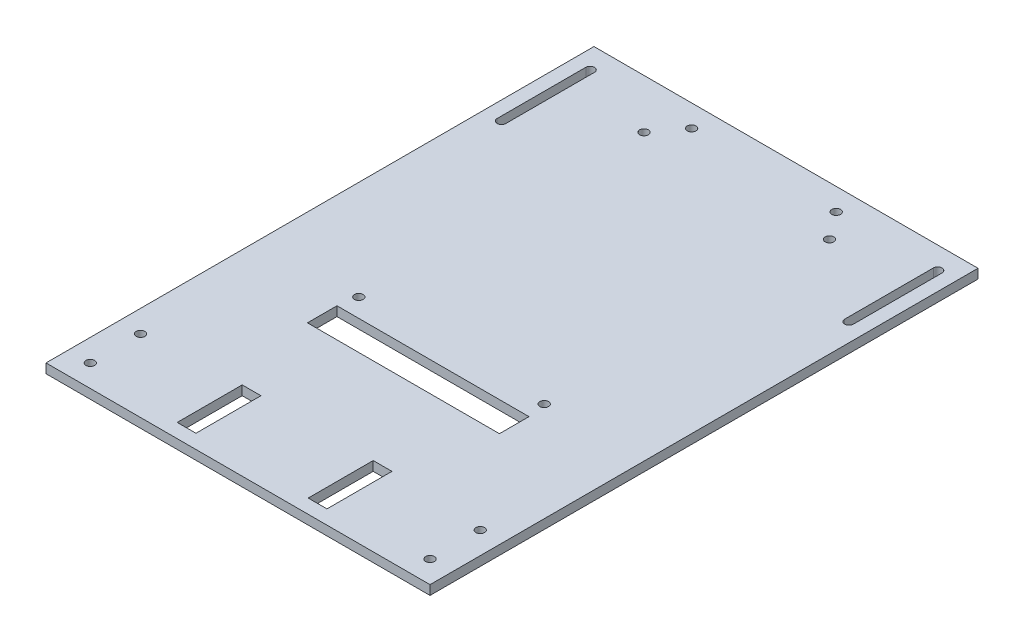
ISO-10303-21;
HEADER;
FILE_DESCRIPTION(('STEP AP214'),'2;1');
FILE_NAME('part.step','',(''),(''),'','','');
FILE_SCHEMA(('AUTOMOTIVE_DESIGN { 1 0 10303 214 1 1 1 1 }'));
ENDSEC;
DATA;
#1=APPLICATION_CONTEXT('core data for automotive mechanical design processes');
#2=APPLICATION_PROTOCOL_DEFINITION('international standard','automotive_design',2000,#1);
#3=PRODUCT_CONTEXT('',#1,'mechanical');
#4=PRODUCT('Part','Part','',(#3));
#5=PRODUCT_RELATED_PRODUCT_CATEGORY('part','',(#4));
#6=PRODUCT_DEFINITION_FORMATION('','',#4);
#7=PRODUCT_DEFINITION_CONTEXT('part definition',#1,'design');
#8=PRODUCT_DEFINITION('design','',#6,#7);
#9=PRODUCT_DEFINITION_SHAPE('','',#8);
#10=(LENGTH_UNIT() NAMED_UNIT(*) SI_UNIT(.MILLI.,.METRE.));
#11=(NAMED_UNIT(*) PLANE_ANGLE_UNIT() SI_UNIT($,.RADIAN.));
#12=(NAMED_UNIT(*) SI_UNIT($,.STERADIAN.) SOLID_ANGLE_UNIT());
#13=UNCERTAINTY_MEASURE_WITH_UNIT(LENGTH_MEASURE(1.E-05),#10,'distance_accuracy_value','');
#14=(GEOMETRIC_REPRESENTATION_CONTEXT(3) GLOBAL_UNCERTAINTY_ASSIGNED_CONTEXT((#13)) GLOBAL_UNIT_ASSIGNED_CONTEXT((#10,
#11,#12)) REPRESENTATION_CONTEXT('',''));
#15=CARTESIAN_POINT('',(0.,0.,0.));
#16=DIRECTION('',(0.,0.,1.));
#17=DIRECTION('',(1.,0.,0.));
#18=AXIS2_PLACEMENT_3D('',#15,#16,#17);
#19=CARTESIAN_POINT('',(0.,3.175,0.));
#20=DIRECTION('',(0.,-1.,0.));
#21=DIRECTION('',(0.,0.,-1.));
#22=AXIS2_PLACEMENT_3D('',#19,#20,#21);
#23=PLANE('',#22);
#24=CARTESIAN_POINT('',(-31.39,3.175,-76.57));
#25=DIRECTION('',(0.,-1.,0.));
#26=DIRECTION('',(0.,0.,-1.));
#27=AXIS2_PLACEMENT_3D('',#24,#25,#26);
#28=CIRCLE('',#27,1.47500000000001);
#29=CARTESIAN_POINT('',(-31.39,3.175,-78.045));
#30=VERTEX_POINT('',#29);
#31=EDGE_CURVE('E265',#30,#30,#28,.T.);
#32=ORIENTED_EDGE('',*,*,#31,.T.);
#33=EDGE_LOOP('',(#32));
#34=FACE_BOUND('',#33,.T.);
#35=CARTESIAN_POINT('',(31.39,3.175,19.98));
#36=DIRECTION('',(0.,-1.,0.));
#37=DIRECTION('',(0.,0.,-1.));
#38=AXIS2_PLACEMENT_3D('',#35,#36,#37);
#39=CIRCLE('',#38,1.475);
#40=CARTESIAN_POINT('',(31.39,3.175,18.505));
#41=VERTEX_POINT('',#40);
#42=EDGE_CURVE('E269',#41,#41,#39,.T.);
#43=ORIENTED_EDGE('',*,*,#42,.T.);
#44=EDGE_LOOP('',(#43));
#45=FACE_BOUND('',#44,.T.);
#46=CARTESIAN_POINT('',(31.39,3.175,-76.57));
#47=DIRECTION('',(0.,-1.,0.));
#48=DIRECTION('',(0.,0.,-1.));
#49=AXIS2_PLACEMENT_3D('',#46,#47,#48);
#50=CIRCLE('',#49,1.47500000000001);
#51=CARTESIAN_POINT('',(31.39,3.175,-78.045));
#52=VERTEX_POINT('',#51);
#53=EDGE_CURVE('E273',#52,#52,#50,.T.);
#54=ORIENTED_EDGE('',*,*,#53,.T.);
#55=EDGE_LOOP('',(#54));
#56=FACE_BOUND('',#55,.T.);
#57=CARTESIAN_POINT('',(-31.39,3.175,19.98));
#58=DIRECTION('',(0.,-1.,0.));
#59=DIRECTION('',(0.,0.,-1.));
#60=AXIS2_PLACEMENT_3D('',#57,#58,#59);
#61=CIRCLE('',#60,1.47500000000001);
#62=CARTESIAN_POINT('',(-31.39,3.175,18.505));
#63=VERTEX_POINT('',#62);
#64=EDGE_CURVE('E277',#63,#63,#61,.T.);
#65=ORIENTED_EDGE('',*,*,#64,.T.);
#66=EDGE_LOOP('',(#65));
#67=FACE_BOUND('',#66,.T.);
#68=DIRECTION('',(0.,0.,-1.));
#69=VECTOR('',#68,1.);
#70=CARTESIAN_POINT('',(65.,3.175,92.25));
#71=LINE('',#70,#69);
#72=CARTESIAN_POINT('',(65.,3.175,92.25));
#73=VERTEX_POINT('',#72);
#74=CARTESIAN_POINT('',(65.,3.175,-93.25));
#75=VERTEX_POINT('',#74);
#76=EDGE_CURVE('E392',#73,#75,#71,.T.);
#77=ORIENTED_EDGE('',*,*,#76,.T.);
#78=DIRECTION('',(1.,0.,0.));
#79=VECTOR('',#78,1.);
#80=CARTESIAN_POINT('',(65.,3.175,-93.25));
#81=LINE('',#80,#79);
#82=CARTESIAN_POINT('',(-65.,3.175,-93.25));
#83=VERTEX_POINT('',#82);
#84=EDGE_CURVE('E580',#83,#75,#81,.T.);
#85=ORIENTED_EDGE('',*,*,#84,.F.);
#86=DIRECTION('',(0.,0.,1.));
#87=VECTOR('',#86,1.);
#88=CARTESIAN_POINT('',(-65.,3.175,92.25));
#89=LINE('',#88,#87);
#90=CARTESIAN_POINT('',(-65.,3.175,92.25));
#91=VERTEX_POINT('',#90);
#92=EDGE_CURVE('E401',#83,#91,#89,.T.);
#93=ORIENTED_EDGE('',*,*,#92,.T.);
#94=DIRECTION('',(1.,0.,0.));
#95=VECTOR('',#94,1.);
#96=CARTESIAN_POINT('',(-65.,3.175,92.25));
#97=LINE('',#96,#95);
#98=EDGE_CURVE('E395',#91,#73,#97,.T.);
#99=ORIENTED_EDGE('',*,*,#98,.T.);
#100=EDGE_LOOP('',(#77,#85,#93,#99));
#101=FACE_BOUND('',#100,.T.);
#102=DIRECTION('',(0.,0.,-1.));
#103=VECTOR('',#102,1.);
#104=CARTESIAN_POINT('',(57.35,3.175,-85.775));
#105=LINE('',#104,#103);
#106=CARTESIAN_POINT('',(57.35,3.175,-55.775));
#107=VERTEX_POINT('',#106);
#108=CARTESIAN_POINT('',(57.35,3.175,-85.775));
#109=VERTEX_POINT('',#108);
#110=EDGE_CURVE('E414',#107,#109,#105,.T.);
#111=ORIENTED_EDGE('',*,*,#110,.T.);
#112=CARTESIAN_POINT('',(58.825,3.175,-85.775));
#113=DIRECTION('',(0.,-1.,0.));
#114=DIRECTION('',(0.,0.,-1.));
#115=AXIS2_PLACEMENT_3D('',#112,#113,#114);
#116=CIRCLE('',#115,1.47499999999999);
#117=CARTESIAN_POINT('',(60.3,3.175,-85.775));
#118=VERTEX_POINT('',#117);
#119=EDGE_CURVE('E428',#109,#118,#116,.T.);
#120=ORIENTED_EDGE('',*,*,#119,.T.);
#121=DIRECTION('',(0.,0.,1.));
#122=VECTOR('',#121,1.);
#123=CARTESIAN_POINT('',(60.3,3.175,-85.775));
#124=LINE('',#123,#122);
#125=CARTESIAN_POINT('',(60.3,3.175,-55.775));
#126=VERTEX_POINT('',#125);
#127=EDGE_CURVE('E454',#118,#126,#124,.T.);
#128=ORIENTED_EDGE('',*,*,#127,.T.);
#129=CARTESIAN_POINT('',(58.825,3.175,-55.775));
#130=DIRECTION('',(0.,-1.,0.));
#131=DIRECTION('',(0.,0.,-1.));
#132=AXIS2_PLACEMENT_3D('',#129,#130,#131);
#133=CIRCLE('',#132,1.47499999999999);
#134=EDGE_CURVE('E450',#126,#107,#133,.T.);
#135=ORIENTED_EDGE('',*,*,#134,.T.);
#136=EDGE_LOOP('',(#111,#120,#128,#135));
#137=FACE_BOUND('',#136,.T.);
#138=CARTESIAN_POINT('',(57.5,3.175,84.75));
#139=DIRECTION('',(0.,-1.,0.));
#140=DIRECTION('',(0.,0.,-1.));
#141=AXIS2_PLACEMENT_3D('',#138,#139,#140);
#142=CIRCLE('',#141,1.475);
#143=CARTESIAN_POINT('',(57.5,3.175,83.275));
#144=VERTEX_POINT('',#143);
#145=EDGE_CURVE('E560',#144,#144,#142,.T.);
#146=ORIENTED_EDGE('',*,*,#145,.T.);
#147=EDGE_LOOP('',(#146));
#148=FACE_BOUND('',#147,.T.);
#149=CARTESIAN_POINT('',(57.5,3.175,67.75));
#150=DIRECTION('',(0.,-1.,0.));
#151=DIRECTION('',(0.,0.,-1.));
#152=AXIS2_PLACEMENT_3D('',#149,#150,#151);
#153=CIRCLE('',#152,1.475);
#154=CARTESIAN_POINT('',(57.5,3.175,66.275));
#155=VERTEX_POINT('',#154);
#156=EDGE_CURVE('E552',#155,#155,#153,.T.);
#157=ORIENTED_EDGE('',*,*,#156,.T.);
#158=EDGE_LOOP('',(#157));
#159=FACE_BOUND('',#158,.T.);
#160=CARTESIAN_POINT('',(-57.5,3.175,84.75));
#161=DIRECTION('',(0.,-1.,0.));
#162=DIRECTION('',(0.,0.,-1.));
#163=AXIS2_PLACEMENT_3D('',#160,#161,#162);
#164=CIRCLE('',#163,1.475);
#165=CARTESIAN_POINT('',(-57.5,3.175,83.275));
#166=VERTEX_POINT('',#165);
#167=EDGE_CURVE('E541',#166,#166,#164,.T.);
#168=ORIENTED_EDGE('',*,*,#167,.T.);
#169=EDGE_LOOP('',(#168));
#170=FACE_BOUND('',#169,.T.);
#171=CARTESIAN_POINT('',(-57.5,3.175,67.75));
#172=DIRECTION('',(0.,-1.,0.));
#173=DIRECTION('',(0.,0.,-1.));
#174=AXIS2_PLACEMENT_3D('',#171,#172,#173);
#175=CIRCLE('',#174,1.475);
#176=CARTESIAN_POINT('',(-57.5,3.175,66.275));
#177=VERTEX_POINT('',#176);
#178=EDGE_CURVE('E483',#177,#177,#175,.T.);
#179=ORIENTED_EDGE('',*,*,#178,.T.);
#180=EDGE_LOOP('',(#179));
#181=FACE_BOUND('',#180,.T.);
#182=DIRECTION('',(0.,0.,-1.));
#183=VECTOR('',#182,1.);
#184=CARTESIAN_POINT('',(-60.3,3.175,-85.775));
#185=LINE('',#184,#183);
#186=CARTESIAN_POINT('',(-60.3,3.175,-55.775));
#187=VERTEX_POINT('',#186);
#188=CARTESIAN_POINT('',(-60.3,3.175,-85.775));
#189=VERTEX_POINT('',#188);
#190=EDGE_CURVE('E474',#187,#189,#185,.T.);
#191=ORIENTED_EDGE('',*,*,#190,.T.);
#192=CARTESIAN_POINT('',(-58.825,3.175,-85.775));
#193=DIRECTION('',(0.,-1.,0.));
#194=DIRECTION('',(0.,0.,-1.));
#195=AXIS2_PLACEMENT_3D('',#192,#193,#194);
#196=CIRCLE('',#195,1.475);
#197=CARTESIAN_POINT('',(-57.35,3.175,-85.775));
#198=VERTEX_POINT('',#197);
#199=EDGE_CURVE('E461',#189,#198,#196,.T.);
#200=ORIENTED_EDGE('',*,*,#199,.T.);
#201=DIRECTION('',(0.,0.,1.));
#202=VECTOR('',#201,1.);
#203=CARTESIAN_POINT('',(-57.35,3.175,-85.775));
#204=LINE('',#203,#202);
#205=CARTESIAN_POINT('',(-57.35,3.175,-55.775));
#206=VERTEX_POINT('',#205);
#207=EDGE_CURVE('E466',#198,#206,#204,.T.);
#208=ORIENTED_EDGE('',*,*,#207,.T.);
#209=CARTESIAN_POINT('',(-58.825,3.175,-55.775));
#210=DIRECTION('',(0.,-1.,0.));
#211=DIRECTION('',(0.,0.,-1.));
#212=AXIS2_PLACEMENT_3D('',#209,#210,#211);
#213=CIRCLE('',#212,1.475);
#214=EDGE_CURVE('E470',#206,#187,#213,.T.);
#215=ORIENTED_EDGE('',*,*,#214,.T.);
#216=EDGE_LOOP('',(#191,#200,#208,#215));
#217=FACE_BOUND('',#216,.T.);
#218=CARTESIAN_POINT('',(24.475,3.175,-85.775));
#219=DIRECTION('',(0.,-1.,0.));
#220=DIRECTION('',(0.,0.,-1.));
#221=AXIS2_PLACEMENT_3D('',#218,#219,#220);
#222=CIRCLE('',#221,1.47500000000001);
#223=CARTESIAN_POINT('',(24.475,3.175,-87.25));
#224=VERTEX_POINT('',#223);
#225=EDGE_CURVE('E571',#224,#224,#222,.T.);
#226=ORIENTED_EDGE('',*,*,#225,.T.);
#227=EDGE_LOOP('',(#226));
#228=FACE_BOUND('',#227,.T.);
#229=CARTESIAN_POINT('',(-24.475,3.175,-85.775));
#230=DIRECTION('',(0.,-1.,0.));
#231=DIRECTION('',(0.,0.,-1.));
#232=AXIS2_PLACEMENT_3D('',#229,#230,#231);
#233=CIRCLE('',#232,1.47500000000001);
#234=CARTESIAN_POINT('',(-24.475,3.175,-87.25));
#235=VERTEX_POINT('',#234);
#236=EDGE_CURVE('E529',#235,#235,#233,.T.);
#237=ORIENTED_EDGE('',*,*,#236,.T.);
#238=EDGE_LOOP('',(#237));
#239=FACE_BOUND('',#238,.T.);
#240=DIRECTION('',(-1.,0.,0.));
#241=VECTOR('',#240,1.);
#242=CARTESIAN_POINT('',(0.,3.175,87.48843537));
#243=LINE('',#242,#241);
#244=CARTESIAN_POINT('',(-19.,3.175,87.48843537));
#245=VERTEX_POINT('',#244);
#246=CARTESIAN_POINT('',(-25.35,3.175,87.48843537));
#247=VERTEX_POINT('',#246);
#248=EDGE_CURVE('E333',#245,#247,#243,.T.);
#249=ORIENTED_EDGE('',*,*,#248,.T.);
#250=DIRECTION('',(0.,0.,-1.));
#251=VECTOR('',#250,1.);
#252=CARTESIAN_POINT('',(-25.35,3.175,0.));
#253=LINE('',#252,#251);
#254=CARTESIAN_POINT('',(-25.35,3.175,65.48843537));
#255=VERTEX_POINT('',#254);
#256=EDGE_CURVE('E346',#247,#255,#253,.T.);
#257=ORIENTED_EDGE('',*,*,#256,.T.);
#258=DIRECTION('',(1.,0.,0.));
#259=VECTOR('',#258,1.);
#260=CARTESIAN_POINT('',(0.,3.175,65.48843537));
#261=LINE('',#260,#259);
#262=CARTESIAN_POINT('',(-19.,3.175,65.48843537));
#263=VERTEX_POINT('',#262);
#264=EDGE_CURVE('E342',#255,#263,#261,.T.);
#265=ORIENTED_EDGE('',*,*,#264,.T.);
#266=DIRECTION('',(0.,0.,1.));
#267=VECTOR('',#266,1.);
#268=CARTESIAN_POINT('',(-19.,3.175,0.));
#269=LINE('',#268,#267);
#270=EDGE_CURVE('E337',#263,#245,#269,.T.);
#271=ORIENTED_EDGE('',*,*,#270,.T.);
#272=EDGE_LOOP('',(#249,#257,#265,#271));
#273=FACE_BOUND('',#272,.T.);
#274=DIRECTION('',(-1.,0.,0.));
#275=VECTOR('',#274,1.);
#276=CARTESIAN_POINT('',(0.,3.175,87.48843537));
#277=LINE('',#276,#275);
#278=CARTESIAN_POINT('',(25.35,3.175,87.48843537));
#279=VERTEX_POINT('',#278);
#280=CARTESIAN_POINT('',(19.,3.175,87.48843537));
#281=VERTEX_POINT('',#280);
#282=EDGE_CURVE('E350',#279,#281,#277,.T.);
#283=ORIENTED_EDGE('',*,*,#282,.T.);
#284=DIRECTION('',(0.,0.,-1.));
#285=VECTOR('',#284,1.);
#286=CARTESIAN_POINT('',(19.,3.175,0.));
#287=LINE('',#286,#285);
#288=CARTESIAN_POINT('',(19.,3.175,65.48843537));
#289=VERTEX_POINT('',#288);
#290=EDGE_CURVE('E362',#281,#289,#287,.T.);
#291=ORIENTED_EDGE('',*,*,#290,.T.);
#292=DIRECTION('',(1.,0.,0.));
#293=VECTOR('',#292,1.);
#294=CARTESIAN_POINT('',(0.,3.175,65.48843537));
#295=LINE('',#294,#293);
#296=CARTESIAN_POINT('',(25.35,3.175,65.48843537));
#297=VERTEX_POINT('',#296);
#298=EDGE_CURVE('E358',#289,#297,#295,.T.);
#299=ORIENTED_EDGE('',*,*,#298,.T.);
#300=DIRECTION('',(0.,0.,1.));
#301=VECTOR('',#300,1.);
#302=CARTESIAN_POINT('',(25.35,3.175,0.));
#303=LINE('',#302,#301);
#304=EDGE_CURVE('E354',#297,#279,#303,.T.);
#305=ORIENTED_EDGE('',*,*,#304,.T.);
#306=EDGE_LOOP('',(#283,#291,#299,#305));
#307=FACE_BOUND('',#306,.T.);
#308=DIRECTION('',(0.,0.,-1.));
#309=VECTOR('',#308,1.);
#310=CARTESIAN_POINT('',(32.5,3.175,0.));
#311=LINE('',#310,#309);
#312=CARTESIAN_POINT('',(32.5,3.175,36.25));
#313=VERTEX_POINT('',#312);
#314=CARTESIAN_POINT('',(32.5,3.175,26.25));
#315=VERTEX_POINT('',#314);
#316=EDGE_CURVE('E306',#313,#315,#311,.T.);
#317=ORIENTED_EDGE('',*,*,#316,.F.);
#318=DIRECTION('',(1.,0.,0.));
#319=VECTOR('',#318,1.);
#320=CARTESIAN_POINT('',(0.,3.175,36.25));
#321=LINE('',#320,#319);
#322=CARTESIAN_POINT('',(-32.5,3.175,36.25));
#323=VERTEX_POINT('',#322);
#324=EDGE_CURVE('E1143',#323,#313,#321,.T.);
#325=ORIENTED_EDGE('',*,*,#324,.F.);
#326=DIRECTION('',(0.,0.,-1.));
#327=VECTOR('',#326,1.);
#328=CARTESIAN_POINT('',(-32.5,3.175,0.));
#329=LINE('',#328,#327);
#330=CARTESIAN_POINT('',(-32.5,3.175,26.25));
#331=VERTEX_POINT('',#330);
#332=EDGE_CURVE('E234',#323,#331,#329,.T.);
#333=ORIENTED_EDGE('',*,*,#332,.T.);
#334=DIRECTION('',(1.,0.,0.));
#335=VECTOR('',#334,1.);
#336=CARTESIAN_POINT('',(0.,3.175,26.25));
#337=LINE('',#336,#335);
#338=EDGE_CURVE('E1141',#331,#315,#337,.T.);
#339=ORIENTED_EDGE('',*,*,#338,.T.);
#340=EDGE_LOOP('',(#317,#325,#333,#339));
#341=FACE_BOUND('',#340,.T.);
#342=ADVANCED_FACE('F66',(#34,#45,#56,#67,#101,#137,#148,#159,#170,#181,#217,#228,#239,#273,
#307,#341),#23,.F.);
#343=CARTESIAN_POINT('',(0.,0.,0.));
#344=DIRECTION('',(0.,-1.,0.));
#345=DIRECTION('',(0.,0.,-1.));
#346=AXIS2_PLACEMENT_3D('',#343,#344,#345);
#347=PLANE('',#346);
#348=CARTESIAN_POINT('',(-31.39,0.,-76.57));
#349=DIRECTION('',(0.,-1.,0.));
#350=DIRECTION('',(0.,0.,-1.));
#351=AXIS2_PLACEMENT_3D('',#348,#349,#350);
#352=CIRCLE('',#351,1.47500000000001);
#353=CARTESIAN_POINT('',(-31.39,0.,-78.045));
#354=VERTEX_POINT('',#353);
#355=EDGE_CURVE('E286',#354,#354,#352,.T.);
#356=ORIENTED_EDGE('',*,*,#355,.F.);
#357=EDGE_LOOP('',(#356));
#358=FACE_BOUND('',#357,.T.);
#359=CARTESIAN_POINT('',(31.39,0.,19.98));
#360=DIRECTION('',(0.,-1.,0.));
#361=DIRECTION('',(0.,0.,-1.));
#362=AXIS2_PLACEMENT_3D('',#359,#360,#361);
#363=CIRCLE('',#362,1.475);
#364=CARTESIAN_POINT('',(31.39,0.,18.505));
#365=VERTEX_POINT('',#364);
#366=EDGE_CURVE('E287',#365,#365,#363,.T.);
#367=ORIENTED_EDGE('',*,*,#366,.F.);
#368=EDGE_LOOP('',(#367));
#369=FACE_BOUND('',#368,.T.);
#370=CARTESIAN_POINT('',(31.39,0.,-76.57));
#371=DIRECTION('',(0.,-1.,0.));
#372=DIRECTION('',(0.,0.,-1.));
#373=AXIS2_PLACEMENT_3D('',#370,#371,#372);
#374=CIRCLE('',#373,1.47500000000001);
#375=CARTESIAN_POINT('',(31.39,0.,-78.045));
#376=VERTEX_POINT('',#375);
#377=EDGE_CURVE('E816',#376,#376,#374,.T.);
#378=ORIENTED_EDGE('',*,*,#377,.F.);
#379=EDGE_LOOP('',(#378));
#380=FACE_BOUND('',#379,.T.);
#381=CARTESIAN_POINT('',(-31.39,0.,19.98));
#382=DIRECTION('',(0.,-1.,0.));
#383=DIRECTION('',(0.,0.,-1.));
#384=AXIS2_PLACEMENT_3D('',#381,#382,#383);
#385=CIRCLE('',#384,1.47500000000001);
#386=CARTESIAN_POINT('',(-31.39,0.,18.505));
#387=VERTEX_POINT('',#386);
#388=EDGE_CURVE('E281',#387,#387,#385,.T.);
#389=ORIENTED_EDGE('',*,*,#388,.F.);
#390=EDGE_LOOP('',(#389));
#391=FACE_BOUND('',#390,.T.);
#392=DIRECTION('',(0.,0.,1.));
#393=VECTOR('',#392,1.);
#394=CARTESIAN_POINT('',(19.,0.,87.48843537));
#395=LINE('',#394,#393);
#396=CARTESIAN_POINT('',(19.,0.,65.48843537));
#397=VERTEX_POINT('',#396);
#398=CARTESIAN_POINT('',(19.,0.,87.48843537));
#399=VERTEX_POINT('',#398);
#400=EDGE_CURVE('E299',#397,#399,#395,.T.);
#401=ORIENTED_EDGE('',*,*,#400,.T.);
#402=DIRECTION('',(1.,0.,0.));
#403=VECTOR('',#402,1.);
#404=CARTESIAN_POINT('',(19.,0.,87.48843537));
#405=LINE('',#404,#403);
#406=CARTESIAN_POINT('',(25.35,0.,87.48843537));
#407=VERTEX_POINT('',#406);
#408=EDGE_CURVE('E304',#399,#407,#405,.T.);
#409=ORIENTED_EDGE('',*,*,#408,.T.);
#410=DIRECTION('',(0.,0.,-1.));
#411=VECTOR('',#410,1.);
#412=CARTESIAN_POINT('',(25.35,0.,87.48843537));
#413=LINE('',#412,#411);
#414=CARTESIAN_POINT('',(25.35,0.,65.48843537));
#415=VERTEX_POINT('',#414);
#416=EDGE_CURVE('E312',#407,#415,#413,.T.);
#417=ORIENTED_EDGE('',*,*,#416,.T.);
#418=DIRECTION('',(-1.,0.,0.));
#419=VECTOR('',#418,1.);
#420=CARTESIAN_POINT('',(19.,0.,65.48843537));
#421=LINE('',#420,#419);
#422=EDGE_CURVE('E317',#415,#397,#421,.T.);
#423=ORIENTED_EDGE('',*,*,#422,.T.);
#424=EDGE_LOOP('',(#401,#409,#417,#423));
#425=FACE_BOUND('',#424,.T.);
#426=DIRECTION('',(0.,0.,1.));
#427=VECTOR('',#426,1.);
#428=CARTESIAN_POINT('',(-25.35,0.,87.48843537));
#429=LINE('',#428,#427);
#430=CARTESIAN_POINT('',(-25.35,0.,65.48843537));
#431=VERTEX_POINT('',#430);
#432=CARTESIAN_POINT('',(-25.35,0.,87.48843537));
#433=VERTEX_POINT('',#432);
#434=EDGE_CURVE('E305',#431,#433,#429,.T.);
#435=ORIENTED_EDGE('',*,*,#434,.T.);
#436=DIRECTION('',(1.,0.,0.));
#437=VECTOR('',#436,1.);
#438=CARTESIAN_POINT('',(-25.35,0.,87.48843537));
#439=LINE('',#438,#437);
#440=CARTESIAN_POINT('',(-19.,0.,87.48843537));
#441=VERTEX_POINT('',#440);
#442=EDGE_CURVE('E330',#433,#441,#439,.T.);
#443=ORIENTED_EDGE('',*,*,#442,.T.);
#444=DIRECTION('',(0.,0.,-1.));
#445=VECTOR('',#444,1.);
#446=CARTESIAN_POINT('',(-19.,0.,87.48843537));
#447=LINE('',#446,#445);
#448=CARTESIAN_POINT('',(-19.,0.,65.48843537));
#449=VERTEX_POINT('',#448);
#450=EDGE_CURVE('E591',#441,#449,#447,.T.);
#451=ORIENTED_EDGE('',*,*,#450,.T.);
#452=DIRECTION('',(-1.,0.,0.));
#453=VECTOR('',#452,1.);
#454=CARTESIAN_POINT('',(-25.35,0.,65.48843537));
#455=LINE('',#454,#453);
#456=EDGE_CURVE('E586',#449,#431,#455,.T.);
#457=ORIENTED_EDGE('',*,*,#456,.T.);
#458=EDGE_LOOP('',(#435,#443,#451,#457));
#459=FACE_BOUND('',#458,.T.);
#460=CARTESIAN_POINT('',(-24.475,0.,-85.775));
#461=DIRECTION('',(0.,-1.,0.));
#462=DIRECTION('',(0.,0.,-1.));
#463=AXIS2_PLACEMENT_3D('',#460,#461,#462);
#464=CIRCLE('',#463,1.47500000000001);
#465=CARTESIAN_POINT('',(-24.475,0.,-87.25));
#466=VERTEX_POINT('',#465);
#467=EDGE_CURVE('E574',#466,#466,#464,.T.);
#468=ORIENTED_EDGE('',*,*,#467,.F.);
#469=EDGE_LOOP('',(#468));
#470=FACE_BOUND('',#469,.T.);
#471=CARTESIAN_POINT('',(24.475,0.,-85.775));
#472=DIRECTION('',(0.,-1.,0.));
#473=DIRECTION('',(0.,0.,-1.));
#474=AXIS2_PLACEMENT_3D('',#471,#472,#473);
#475=CIRCLE('',#474,1.47500000000001);
#476=CARTESIAN_POINT('',(24.475,0.,-87.25));
#477=VERTEX_POINT('',#476);
#478=EDGE_CURVE('E575',#477,#477,#475,.T.);
#479=ORIENTED_EDGE('',*,*,#478,.F.);
#480=EDGE_LOOP('',(#479));
#481=FACE_BOUND('',#480,.T.);
#482=CARTESIAN_POINT('',(-58.825,0.,-85.775));
#483=DIRECTION('',(0.,-1.,0.));
#484=DIRECTION('',(0.,0.,-1.));
#485=AXIS2_PLACEMENT_3D('',#482,#483,#484);
#486=CIRCLE('',#485,1.475);
#487=CARTESIAN_POINT('',(-60.3,0.,-85.775));
#488=VERTEX_POINT('',#487);
#489=CARTESIAN_POINT('',(-57.35,0.,-85.775));
#490=VERTEX_POINT('',#489);
#491=EDGE_CURVE('E479',#488,#490,#486,.T.);
#492=ORIENTED_EDGE('',*,*,#491,.F.);
#493=DIRECTION('',(0.,0.,-1.));
#494=VECTOR('',#493,1.);
#495=CARTESIAN_POINT('',(-60.3,0.,-85.775));
#496=LINE('',#495,#494);
#497=CARTESIAN_POINT('',(-60.3,0.,-55.775));
#498=VERTEX_POINT('',#497);
#499=EDGE_CURVE('E465',#498,#488,#496,.T.);
#500=ORIENTED_EDGE('',*,*,#499,.F.);
#501=CARTESIAN_POINT('',(-58.825,0.,-55.775));
#502=DIRECTION('',(0.,-1.,0.));
#503=DIRECTION('',(0.,0.,-1.));
#504=AXIS2_PLACEMENT_3D('',#501,#502,#503);
#505=CIRCLE('',#504,1.475);
#506=CARTESIAN_POINT('',(-57.35,0.,-55.775));
#507=VERTEX_POINT('',#506);
#508=EDGE_CURVE('E499',#507,#498,#505,.T.);
#509=ORIENTED_EDGE('',*,*,#508,.F.);
#510=DIRECTION('',(0.,0.,1.));
#511=VECTOR('',#510,1.);
#512=CARTESIAN_POINT('',(-57.35,0.,-85.775));
#513=LINE('',#512,#511);
#514=EDGE_CURVE('E484',#490,#507,#513,.T.);
#515=ORIENTED_EDGE('',*,*,#514,.F.);
#516=EDGE_LOOP('',(#492,#500,#509,#515));
#517=FACE_BOUND('',#516,.T.);
#518=CARTESIAN_POINT('',(-57.5,0.,67.75));
#519=DIRECTION('',(0.,-1.,0.));
#520=DIRECTION('',(0.,0.,-1.));
#521=AXIS2_PLACEMENT_3D('',#518,#519,#520);
#522=CIRCLE('',#521,1.475);
#523=CARTESIAN_POINT('',(-57.5,0.,66.275));
#524=VERTEX_POINT('',#523);
#525=EDGE_CURVE('E536',#524,#524,#522,.T.);
#526=ORIENTED_EDGE('',*,*,#525,.F.);
#527=EDGE_LOOP('',(#526));
#528=FACE_BOUND('',#527,.T.);
#529=CARTESIAN_POINT('',(-57.5,0.,84.75));
#530=DIRECTION('',(0.,-1.,0.));
#531=DIRECTION('',(0.,0.,-1.));
#532=AXIS2_PLACEMENT_3D('',#529,#530,#531);
#533=CIRCLE('',#532,1.475);
#534=CARTESIAN_POINT('',(-57.5,0.,83.275));
#535=VERTEX_POINT('',#534);
#536=EDGE_CURVE('E547',#535,#535,#533,.T.);
#537=ORIENTED_EDGE('',*,*,#536,.F.);
#538=EDGE_LOOP('',(#537));
#539=FACE_BOUND('',#538,.T.);
#540=CARTESIAN_POINT('',(57.5,0.,67.75));
#541=DIRECTION('',(0.,-1.,0.));
#542=DIRECTION('',(0.,0.,-1.));
#543=AXIS2_PLACEMENT_3D('',#540,#541,#542);
#544=CIRCLE('',#543,1.475);
#545=CARTESIAN_POINT('',(57.5,0.,66.275));
#546=VERTEX_POINT('',#545);
#547=EDGE_CURVE('E555',#546,#546,#544,.T.);
#548=ORIENTED_EDGE('',*,*,#547,.F.);
#549=EDGE_LOOP('',(#548));
#550=FACE_BOUND('',#549,.T.);
#551=CARTESIAN_POINT('',(57.5,0.,84.75));
#552=DIRECTION('',(0.,-1.,0.));
#553=DIRECTION('',(0.,0.,-1.));
#554=AXIS2_PLACEMENT_3D('',#551,#552,#553);
#555=CIRCLE('',#554,1.475);
#556=CARTESIAN_POINT('',(57.5,0.,83.275));
#557=VERTEX_POINT('',#556);
#558=EDGE_CURVE('E446',#557,#557,#555,.T.);
#559=ORIENTED_EDGE('',*,*,#558,.F.);
#560=EDGE_LOOP('',(#559));
#561=FACE_BOUND('',#560,.T.);
#562=CARTESIAN_POINT('',(58.825,0.,-85.775));
#563=DIRECTION('',(0.,-1.,0.));
#564=DIRECTION('',(0.,0.,-1.));
#565=AXIS2_PLACEMENT_3D('',#562,#563,#564);
#566=CIRCLE('',#565,1.47499999999999);
#567=CARTESIAN_POINT('',(57.35,0.,-85.775));
#568=VERTEX_POINT('',#567);
#569=CARTESIAN_POINT('',(60.3,0.,-85.775));
#570=VERTEX_POINT('',#569);
#571=EDGE_CURVE('E442',#568,#570,#566,.T.);
#572=ORIENTED_EDGE('',*,*,#571,.F.);
#573=DIRECTION('',(0.,0.,-1.));
#574=VECTOR('',#573,1.);
#575=CARTESIAN_POINT('',(57.35,0.,-85.775));
#576=LINE('',#575,#574);
#577=CARTESIAN_POINT('',(57.35,0.,-55.775));
#578=VERTEX_POINT('',#577);
#579=EDGE_CURVE('E423',#578,#568,#576,.T.);
#580=ORIENTED_EDGE('',*,*,#579,.F.);
#581=CARTESIAN_POINT('',(58.825,0.,-55.775));
#582=DIRECTION('',(0.,-1.,0.));
#583=DIRECTION('',(0.,0.,-1.));
#584=AXIS2_PLACEMENT_3D('',#581,#582,#583);
#585=CIRCLE('',#584,1.47499999999999);
#586=CARTESIAN_POINT('',(60.3,0.,-55.775));
#587=VERTEX_POINT('',#586);
#588=EDGE_CURVE('E429',#587,#578,#585,.T.);
#589=ORIENTED_EDGE('',*,*,#588,.F.);
#590=DIRECTION('',(0.,0.,1.));
#591=VECTOR('',#590,1.);
#592=CARTESIAN_POINT('',(60.3,0.,-85.775));
#593=LINE('',#592,#591);
#594=EDGE_CURVE('E438',#570,#587,#593,.T.);
#595=ORIENTED_EDGE('',*,*,#594,.F.);
#596=EDGE_LOOP('',(#572,#580,#589,#595));
#597=FACE_BOUND('',#596,.T.);
#598=DIRECTION('',(0.,0.,-1.));
#599=VECTOR('',#598,1.);
#600=CARTESIAN_POINT('',(65.,0.,92.25));
#601=LINE('',#600,#599);
#602=CARTESIAN_POINT('',(65.,0.,92.25));
#603=VERTEX_POINT('',#602);
#604=CARTESIAN_POINT('',(65.,0.,-93.25));
#605=VERTEX_POINT('',#604);
#606=EDGE_CURVE('E387',#603,#605,#601,.T.);
#607=ORIENTED_EDGE('',*,*,#606,.F.);
#608=DIRECTION('',(1.,0.,0.));
#609=VECTOR('',#608,1.);
#610=CARTESIAN_POINT('',(-65.,0.,92.25));
#611=LINE('',#610,#609);
#612=CARTESIAN_POINT('',(-65.,0.,92.25));
#613=VERTEX_POINT('',#612);
#614=EDGE_CURVE('E386',#613,#603,#611,.T.);
#615=ORIENTED_EDGE('',*,*,#614,.F.);
#616=DIRECTION('',(0.,0.,1.));
#617=VECTOR('',#616,1.);
#618=CARTESIAN_POINT('',(-65.,0.,92.25));
#619=LINE('',#618,#617);
#620=CARTESIAN_POINT('',(-65.,0.,-93.25));
#621=VERTEX_POINT('',#620);
#622=EDGE_CURVE('E382',#621,#613,#619,.T.);
#623=ORIENTED_EDGE('',*,*,#622,.F.);
#624=DIRECTION('',(-1.,0.,0.));
#625=VECTOR('',#624,1.);
#626=CARTESIAN_POINT('',(65.,0.,-93.25));
#627=LINE('',#626,#625);
#628=EDGE_CURVE('E370',#605,#621,#627,.T.);
#629=ORIENTED_EDGE('',*,*,#628,.F.);
#630=EDGE_LOOP('',(#607,#615,#623,#629));
#631=FACE_BOUND('',#630,.T.);
#632=DIRECTION('',(1.,0.,0.));
#633=VECTOR('',#632,1.);
#634=CARTESIAN_POINT('',(0.,0.,36.25));
#635=LINE('',#634,#633);
#636=CARTESIAN_POINT('',(-32.5,0.,36.25));
#637=VERTEX_POINT('',#636);
#638=CARTESIAN_POINT('',(32.5,0.,36.25));
#639=VERTEX_POINT('',#638);
#640=EDGE_CURVE('E241',#637,#639,#635,.T.);
#641=ORIENTED_EDGE('',*,*,#640,.T.);
#642=DIRECTION('',(0.,0.,-1.));
#643=VECTOR('',#642,1.);
#644=CARTESIAN_POINT('',(32.5,0.,0.));
#645=LINE('',#644,#643);
#646=CARTESIAN_POINT('',(32.5,0.,26.25));
#647=VERTEX_POINT('',#646);
#648=EDGE_CURVE('E90',#639,#647,#645,.T.);
#649=ORIENTED_EDGE('',*,*,#648,.T.);
#650=DIRECTION('',(1.,0.,0.));
#651=VECTOR('',#650,1.);
#652=CARTESIAN_POINT('',(0.,0.,26.25));
#653=LINE('',#652,#651);
#654=CARTESIAN_POINT('',(-32.5,0.,26.25));
#655=VERTEX_POINT('',#654);
#656=EDGE_CURVE('E248',#655,#647,#653,.T.);
#657=ORIENTED_EDGE('',*,*,#656,.F.);
#658=DIRECTION('',(0.,0.,-1.));
#659=VECTOR('',#658,1.);
#660=CARTESIAN_POINT('',(-32.5,0.,0.));
#661=LINE('',#660,#659);
#662=EDGE_CURVE('E231',#637,#655,#661,.T.);
#663=ORIENTED_EDGE('',*,*,#662,.F.);
#664=EDGE_LOOP('',(#641,#649,#657,#663));
#665=FACE_BOUND('',#664,.T.);
#666=ADVANCED_FACE('F246',(#358,#369,#380,#391,#425,#459,#470,#481,#517,#528,#539,#550,#561,
#597,#631,#665),#347,.T.);
#667=CARTESIAN_POINT('',(65.,3.175,92.25));
#668=DIRECTION('',(-1.,0.,0.));
#669=DIRECTION('',(0.,0.,1.));
#670=AXIS2_PLACEMENT_3D('',#667,#668,#669);
#671=PLANE('',#670);
#672=ORIENTED_EDGE('',*,*,#606,.T.);
#673=DIRECTION('',(0.,-1.,0.));
#674=VECTOR('',#673,1.);
#675=CARTESIAN_POINT('',(65.,0.,-93.25));
#676=LINE('',#675,#674);
#677=EDGE_CURVE('E366',#75,#605,#676,.T.);
#678=ORIENTED_EDGE('',*,*,#677,.F.);
#679=ORIENTED_EDGE('',*,*,#76,.F.);
#680=DIRECTION('',(0.,-1.,0.));
#681=VECTOR('',#680,1.);
#682=CARTESIAN_POINT('',(65.,3.175,92.25));
#683=LINE('',#682,#681);
#684=EDGE_CURVE('E75',#73,#603,#683,.T.);
#685=ORIENTED_EDGE('',*,*,#684,.T.);
#686=EDGE_LOOP('',(#672,#678,#679,#685));
#687=FACE_BOUND('',#686,.T.);
#688=ADVANCED_FACE('F68',(#687),#671,.F.);
#689=CARTESIAN_POINT('',(-65.,3.175,92.25));
#690=DIRECTION('',(1.,0.,0.));
#691=DIRECTION('',(0.,0.,-1.));
#692=AXIS2_PLACEMENT_3D('',#689,#690,#691);
#693=PLANE('',#692);
#694=ORIENTED_EDGE('',*,*,#622,.T.);
#695=DIRECTION('',(0.,-1.,0.));
#696=VECTOR('',#695,1.);
#697=CARTESIAN_POINT('',(-65.,3.175,92.25));
#698=LINE('',#697,#696);
#699=EDGE_CURVE('E13',#91,#613,#698,.T.);
#700=ORIENTED_EDGE('',*,*,#699,.F.);
#701=ORIENTED_EDGE('',*,*,#92,.F.);
#702=DIRECTION('',(0.,1.,0.));
#703=VECTOR('',#702,1.);
#704=CARTESIAN_POINT('',(-65.,0.,-93.25));
#705=LINE('',#704,#703);
#706=EDGE_CURVE('E375',#621,#83,#705,.T.);
#707=ORIENTED_EDGE('',*,*,#706,.F.);
#708=EDGE_LOOP('',(#694,#700,#701,#707));
#709=FACE_BOUND('',#708,.T.);
#710=ADVANCED_FACE('F674',(#709),#693,.F.);
#711=CARTESIAN_POINT('',(-65.,3.175,92.25));
#712=DIRECTION('',(0.,0.,-1.));
#713=DIRECTION('',(-1.,0.,0.));
#714=AXIS2_PLACEMENT_3D('',#711,#712,#713);
#715=PLANE('',#714);
#716=ORIENTED_EDGE('',*,*,#614,.T.);
#717=ORIENTED_EDGE('',*,*,#684,.F.);
#718=ORIENTED_EDGE('',*,*,#98,.F.);
#719=ORIENTED_EDGE('',*,*,#699,.T.);
#720=EDGE_LOOP('',(#716,#717,#718,#719));
#721=FACE_BOUND('',#720,.T.);
#722=ADVANCED_FACE('F672',(#721),#715,.F.);
#723=CARTESIAN_POINT('',(58.825,3.175,-85.775));
#724=DIRECTION('',(0.,-1.,0.));
#725=DIRECTION('',(0.,0.,-1.));
#726=AXIS2_PLACEMENT_3D('',#723,#724,#725);
#727=CYLINDRICAL_SURFACE('',#726,1.47499999999999);
#728=ORIENTED_EDGE('',*,*,#571,.T.);
#729=DIRECTION('',(0.,-1.,0.));
#730=VECTOR('',#729,1.);
#731=CARTESIAN_POINT('',(60.3,3.175,-85.775));
#732=LINE('',#731,#730);
#733=EDGE_CURVE('E409',#118,#570,#732,.T.);
#734=ORIENTED_EDGE('',*,*,#733,.F.);
#735=ORIENTED_EDGE('',*,*,#119,.F.);
#736=DIRECTION('',(0.,-1.,0.));
#737=VECTOR('',#736,1.);
#738=CARTESIAN_POINT('',(57.35,3.175,-85.775));
#739=LINE('',#738,#737);
#740=EDGE_CURVE('E420',#109,#568,#739,.T.);
#741=ORIENTED_EDGE('',*,*,#740,.T.);
#742=EDGE_LOOP('',(#728,#734,#735,#741));
#743=FACE_BOUND('',#742,.T.);
#744=ADVANCED_FACE('F669',(#743),#727,.F.);
#745=CARTESIAN_POINT('',(57.35,3.175,-85.775));
#746=DIRECTION('',(-1.,0.,0.));
#747=DIRECTION('',(0.,0.,1.));
#748=AXIS2_PLACEMENT_3D('',#745,#746,#747);
#749=PLANE('',#748);
#750=ORIENTED_EDGE('',*,*,#579,.T.);
#751=ORIENTED_EDGE('',*,*,#740,.F.);
#752=ORIENTED_EDGE('',*,*,#110,.F.);
#753=DIRECTION('',(0.,-1.,0.));
#754=VECTOR('',#753,1.);
#755=CARTESIAN_POINT('',(57.35,3.175,-55.775));
#756=LINE('',#755,#754);
#757=EDGE_CURVE('E417',#107,#578,#756,.T.);
#758=ORIENTED_EDGE('',*,*,#757,.T.);
#759=EDGE_LOOP('',(#750,#751,#752,#758));
#760=FACE_BOUND('',#759,.T.);
#761=ADVANCED_FACE('F724',(#760),#749,.F.);
#762=CARTESIAN_POINT('',(58.825,3.175,-55.775));
#763=DIRECTION('',(0.,-1.,0.));
#764=DIRECTION('',(0.,0.,-1.));
#765=AXIS2_PLACEMENT_3D('',#762,#763,#764);
#766=CYLINDRICAL_SURFACE('',#765,1.47499999999999);
#767=ORIENTED_EDGE('',*,*,#588,.T.);
#768=ORIENTED_EDGE('',*,*,#757,.F.);
#769=ORIENTED_EDGE('',*,*,#134,.F.);
#770=DIRECTION('',(0.,-1.,0.));
#771=VECTOR('',#770,1.);
#772=CARTESIAN_POINT('',(60.3,3.175,-55.775));
#773=LINE('',#772,#771);
#774=EDGE_CURVE('E413',#126,#587,#773,.T.);
#775=ORIENTED_EDGE('',*,*,#774,.T.);
#776=EDGE_LOOP('',(#767,#768,#769,#775));
#777=FACE_BOUND('',#776,.T.);
#778=ADVANCED_FACE('F726',(#777),#766,.F.);
#779=CARTESIAN_POINT('',(60.3,3.175,-85.775));
#780=DIRECTION('',(1.,0.,0.));
#781=DIRECTION('',(0.,0.,-1.));
#782=AXIS2_PLACEMENT_3D('',#779,#780,#781);
#783=PLANE('',#782);
#784=ORIENTED_EDGE('',*,*,#594,.T.);
#785=ORIENTED_EDGE('',*,*,#774,.F.);
#786=ORIENTED_EDGE('',*,*,#127,.F.);
#787=ORIENTED_EDGE('',*,*,#733,.T.);
#788=EDGE_LOOP('',(#784,#785,#786,#787));
#789=FACE_BOUND('',#788,.T.);
#790=ADVANCED_FACE('F718',(#789),#783,.F.);
#791=CARTESIAN_POINT('',(57.5,3.175,84.75));
#792=DIRECTION('',(0.,-1.,0.));
#793=DIRECTION('',(0.,0.,-1.));
#794=AXIS2_PLACEMENT_3D('',#791,#792,#793);
#795=CYLINDRICAL_SURFACE('',#794,1.475);
#796=ORIENTED_EDGE('',*,*,#145,.F.);
#797=EDGE_LOOP('',(#796));
#798=FACE_BOUND('',#797,.T.);
#799=ORIENTED_EDGE('',*,*,#558,.T.);
#800=EDGE_LOOP('',(#799));
#801=FACE_BOUND('',#800,.T.);
#802=ADVANCED_FACE('F733',(#798,#801),#795,.F.);
#803=CARTESIAN_POINT('',(57.5,3.175,67.75));
#804=DIRECTION('',(0.,-1.,0.));
#805=DIRECTION('',(0.,0.,-1.));
#806=AXIS2_PLACEMENT_3D('',#803,#804,#805);
#807=CYLINDRICAL_SURFACE('',#806,1.475);
#808=ORIENTED_EDGE('',*,*,#156,.F.);
#809=EDGE_LOOP('',(#808));
#810=FACE_BOUND('',#809,.T.);
#811=ORIENTED_EDGE('',*,*,#547,.T.);
#812=EDGE_LOOP('',(#811));
#813=FACE_BOUND('',#812,.T.);
#814=ADVANCED_FACE('F701',(#810,#813),#807,.F.);
#815=CARTESIAN_POINT('',(-57.5,3.175,84.75));
#816=DIRECTION('',(0.,-1.,0.));
#817=DIRECTION('',(0.,0.,-1.));
#818=AXIS2_PLACEMENT_3D('',#815,#816,#817);
#819=CYLINDRICAL_SURFACE('',#818,1.475);
#820=ORIENTED_EDGE('',*,*,#167,.F.);
#821=EDGE_LOOP('',(#820));
#822=FACE_BOUND('',#821,.T.);
#823=ORIENTED_EDGE('',*,*,#536,.T.);
#824=EDGE_LOOP('',(#823));
#825=FACE_BOUND('',#824,.T.);
#826=ADVANCED_FACE('F697',(#822,#825),#819,.F.);
#827=CARTESIAN_POINT('',(-57.5,3.175,67.75));
#828=DIRECTION('',(0.,-1.,0.));
#829=DIRECTION('',(0.,0.,-1.));
#830=AXIS2_PLACEMENT_3D('',#827,#828,#829);
#831=CYLINDRICAL_SURFACE('',#830,1.475);
#832=ORIENTED_EDGE('',*,*,#178,.F.);
#833=EDGE_LOOP('',(#832));
#834=FACE_BOUND('',#833,.T.);
#835=ORIENTED_EDGE('',*,*,#525,.T.);
#836=EDGE_LOOP('',(#835));
#837=FACE_BOUND('',#836,.T.);
#838=ADVANCED_FACE('F700',(#834,#837),#831,.F.);
#839=CARTESIAN_POINT('',(-58.825,3.175,-85.775));
#840=DIRECTION('',(0.,-1.,0.));
#841=DIRECTION('',(0.,0.,-1.));
#842=AXIS2_PLACEMENT_3D('',#839,#840,#841);
#843=CYLINDRICAL_SURFACE('',#842,1.475);
#844=ORIENTED_EDGE('',*,*,#491,.T.);
#845=DIRECTION('',(0.,-1.,0.));
#846=VECTOR('',#845,1.);
#847=CARTESIAN_POINT('',(-57.35,3.175,-85.775));
#848=LINE('',#847,#846);
#849=EDGE_CURVE('E478',#198,#490,#848,.T.);
#850=ORIENTED_EDGE('',*,*,#849,.F.);
#851=ORIENTED_EDGE('',*,*,#199,.F.);
#852=DIRECTION('',(0.,-1.,0.));
#853=VECTOR('',#852,1.);
#854=CARTESIAN_POINT('',(-60.3,3.175,-85.775));
#855=LINE('',#854,#853);
#856=EDGE_CURVE('E500',#189,#488,#855,.T.);
#857=ORIENTED_EDGE('',*,*,#856,.T.);
#858=EDGE_LOOP('',(#844,#850,#851,#857));
#859=FACE_BOUND('',#858,.T.);
#860=ADVANCED_FACE('F739',(#859),#843,.F.);
#861=CARTESIAN_POINT('',(-60.3,3.175,-85.775));
#862=DIRECTION('',(-1.,0.,0.));
#863=DIRECTION('',(0.,0.,1.));
#864=AXIS2_PLACEMENT_3D('',#861,#862,#863);
#865=PLANE('',#864);
#866=ORIENTED_EDGE('',*,*,#499,.T.);
#867=ORIENTED_EDGE('',*,*,#856,.F.);
#868=ORIENTED_EDGE('',*,*,#190,.F.);
#869=DIRECTION('',(0.,-1.,0.));
#870=VECTOR('',#869,1.);
#871=CARTESIAN_POINT('',(-60.3,3.175,-55.775));
#872=LINE('',#871,#870);
#873=EDGE_CURVE('E524',#187,#498,#872,.T.);
#874=ORIENTED_EDGE('',*,*,#873,.T.);
#875=EDGE_LOOP('',(#866,#867,#868,#874));
#876=FACE_BOUND('',#875,.T.);
#877=ADVANCED_FACE('F521',(#876),#865,.F.);
#878=CARTESIAN_POINT('',(-58.825,3.175,-55.775));
#879=DIRECTION('',(0.,-1.,0.));
#880=DIRECTION('',(0.,0.,-1.));
#881=AXIS2_PLACEMENT_3D('',#878,#879,#880);
#882=CYLINDRICAL_SURFACE('',#881,1.475);
#883=ORIENTED_EDGE('',*,*,#508,.T.);
#884=ORIENTED_EDGE('',*,*,#873,.F.);
#885=ORIENTED_EDGE('',*,*,#214,.F.);
#886=DIRECTION('',(0.,-1.,0.));
#887=VECTOR('',#886,1.);
#888=CARTESIAN_POINT('',(-57.35,3.175,-55.775));
#889=LINE('',#888,#887);
#890=EDGE_CURVE('E516',#206,#507,#889,.T.);
#891=ORIENTED_EDGE('',*,*,#890,.T.);
#892=EDGE_LOOP('',(#883,#884,#885,#891));
#893=FACE_BOUND('',#892,.T.);
#894=ADVANCED_FACE('F738',(#893),#882,.F.);
#895=CARTESIAN_POINT('',(-57.35,3.175,-85.775));
#896=DIRECTION('',(1.,0.,0.));
#897=DIRECTION('',(0.,0.,-1.));
#898=AXIS2_PLACEMENT_3D('',#895,#896,#897);
#899=PLANE('',#898);
#900=ORIENTED_EDGE('',*,*,#514,.T.);
#901=ORIENTED_EDGE('',*,*,#890,.F.);
#902=ORIENTED_EDGE('',*,*,#207,.F.);
#903=ORIENTED_EDGE('',*,*,#849,.T.);
#904=EDGE_LOOP('',(#900,#901,#902,#903));
#905=FACE_BOUND('',#904,.T.);
#906=ADVANCED_FACE('F514',(#905),#899,.F.);
#907=CARTESIAN_POINT('',(24.475,10.,-85.775));
#908=DIRECTION('',(0.,-1.,0.));
#909=DIRECTION('',(0.,0.,-1.));
#910=AXIS2_PLACEMENT_3D('',#907,#908,#909);
#911=CYLINDRICAL_SURFACE('',#910,1.47500000000001);
#912=ORIENTED_EDGE('',*,*,#478,.T.);
#913=EDGE_LOOP('',(#912));
#914=FACE_BOUND('',#913,.T.);
#915=ORIENTED_EDGE('',*,*,#225,.F.);
#916=EDGE_LOOP('',(#915));
#917=FACE_BOUND('',#916,.T.);
#918=ADVANCED_FACE('F744',(#914,#917),#911,.F.);
#919=CARTESIAN_POINT('',(-24.475,10.,-85.775));
#920=DIRECTION('',(0.,-1.,0.));
#921=DIRECTION('',(0.,0.,-1.));
#922=AXIS2_PLACEMENT_3D('',#919,#920,#921);
#923=CYLINDRICAL_SURFACE('',#922,1.47500000000001);
#924=ORIENTED_EDGE('',*,*,#467,.T.);
#925=EDGE_LOOP('',(#924));
#926=FACE_BOUND('',#925,.T.);
#927=ORIENTED_EDGE('',*,*,#236,.F.);
#928=EDGE_LOOP('',(#927));
#929=FACE_BOUND('',#928,.T.);
#930=ADVANCED_FACE('F759',(#926,#929),#923,.F.);
#931=CARTESIAN_POINT('',(0.,0.,-93.25));
#932=DIRECTION('',(0.,0.,1.));
#933=DIRECTION('',(1.,0.,0.));
#934=AXIS2_PLACEMENT_3D('',#931,#932,#933);
#935=PLANE('',#934);
#936=ORIENTED_EDGE('',*,*,#677,.T.);
#937=ORIENTED_EDGE('',*,*,#628,.T.);
#938=ORIENTED_EDGE('',*,*,#706,.T.);
#939=ORIENTED_EDGE('',*,*,#84,.T.);
#940=EDGE_LOOP('',(#936,#937,#938,#939));
#941=FACE_BOUND('',#940,.T.);
#942=ADVANCED_FACE('F763',(#941),#935,.F.);
#943=CARTESIAN_POINT('',(-25.35,0.,87.48843537));
#944=DIRECTION('',(-1.,0.,0.));
#945=DIRECTION('',(0.,0.,1.));
#946=AXIS2_PLACEMENT_3D('',#943,#944,#945);
#947=PLANE('',#946);
#948=DIRECTION('',(0.,1.,0.));
#949=VECTOR('',#948,1.);
#950=CARTESIAN_POINT('',(-25.35,0.,87.48843537));
#951=LINE('',#950,#949);
#952=EDGE_CURVE('E592',#433,#247,#951,.T.);
#953=ORIENTED_EDGE('',*,*,#952,.F.);
#954=ORIENTED_EDGE('',*,*,#434,.F.);
#955=DIRECTION('',(0.,1.,0.));
#956=VECTOR('',#955,1.);
#957=CARTESIAN_POINT('',(-25.35,0.,65.48843537));
#958=LINE('',#957,#956);
#959=EDGE_CURVE('E593',#431,#255,#958,.T.);
#960=ORIENTED_EDGE('',*,*,#959,.T.);
#961=ORIENTED_EDGE('',*,*,#256,.F.);
#962=EDGE_LOOP('',(#953,#954,#960,#961));
#963=FACE_BOUND('',#962,.T.);
#964=ADVANCED_FACE('F767',(#963),#947,.F.);
#965=CARTESIAN_POINT('',(-25.35,0.,65.48843537));
#966=DIRECTION('',(0.,0.,-1.));
#967=DIRECTION('',(-1.,0.,0.));
#968=AXIS2_PLACEMENT_3D('',#965,#966,#967);
#969=PLANE('',#968);
#970=ORIENTED_EDGE('',*,*,#959,.F.);
#971=ORIENTED_EDGE('',*,*,#456,.F.);
#972=DIRECTION('',(0.,1.,0.));
#973=VECTOR('',#972,1.);
#974=CARTESIAN_POINT('',(-19.,0.,65.48843537));
#975=LINE('',#974,#973);
#976=EDGE_CURVE('E612',#449,#263,#975,.T.);
#977=ORIENTED_EDGE('',*,*,#976,.T.);
#978=ORIENTED_EDGE('',*,*,#264,.F.);
#979=EDGE_LOOP('',(#970,#971,#977,#978));
#980=FACE_BOUND('',#979,.T.);
#981=ADVANCED_FACE('F769',(#980),#969,.F.);
#982=CARTESIAN_POINT('',(-19.,0.,87.48843537));
#983=DIRECTION('',(1.,0.,0.));
#984=DIRECTION('',(0.,0.,-1.));
#985=AXIS2_PLACEMENT_3D('',#982,#983,#984);
#986=PLANE('',#985);
#987=ORIENTED_EDGE('',*,*,#976,.F.);
#988=ORIENTED_EDGE('',*,*,#450,.F.);
#989=DIRECTION('',(0.,1.,0.));
#990=VECTOR('',#989,1.);
#991=CARTESIAN_POINT('',(-19.,0.,87.48843537));
#992=LINE('',#991,#990);
#993=EDGE_CURVE('E609',#441,#245,#992,.T.);
#994=ORIENTED_EDGE('',*,*,#993,.T.);
#995=ORIENTED_EDGE('',*,*,#270,.F.);
#996=EDGE_LOOP('',(#987,#988,#994,#995));
#997=FACE_BOUND('',#996,.T.);
#998=ADVANCED_FACE('F772',(#997),#986,.F.);
#999=CARTESIAN_POINT('',(-25.35,0.,87.48843537));
#1000=DIRECTION('',(0.,0.,1.));
#1001=DIRECTION('',(1.,0.,0.));
#1002=AXIS2_PLACEMENT_3D('',#999,#1000,#1001);
#1003=PLANE('',#1002);
#1004=ORIENTED_EDGE('',*,*,#993,.F.);
#1005=ORIENTED_EDGE('',*,*,#442,.F.);
#1006=ORIENTED_EDGE('',*,*,#952,.T.);
#1007=ORIENTED_EDGE('',*,*,#248,.F.);
#1008=EDGE_LOOP('',(#1004,#1005,#1006,#1007));
#1009=FACE_BOUND('',#1008,.T.);
#1010=ADVANCED_FACE('F606',(#1009),#1003,.F.);
#1011=CARTESIAN_POINT('',(19.,0.,87.48843537));
#1012=DIRECTION('',(-1.,0.,0.));
#1013=DIRECTION('',(0.,0.,1.));
#1014=AXIS2_PLACEMENT_3D('',#1011,#1012,#1013);
#1015=PLANE('',#1014);
#1016=DIRECTION('',(0.,1.,0.));
#1017=VECTOR('',#1016,1.);
#1018=CARTESIAN_POINT('',(19.,0.,87.48843537));
#1019=LINE('',#1018,#1017);
#1020=EDGE_CURVE('E619',#399,#281,#1019,.T.);
#1021=ORIENTED_EDGE('',*,*,#1020,.F.);
#1022=ORIENTED_EDGE('',*,*,#400,.F.);
#1023=DIRECTION('',(0.,1.,0.));
#1024=VECTOR('',#1023,1.);
#1025=CARTESIAN_POINT('',(19.,0.,65.48843537));
#1026=LINE('',#1025,#1024);
#1027=EDGE_CURVE('E338',#397,#289,#1026,.T.);
#1028=ORIENTED_EDGE('',*,*,#1027,.T.);
#1029=ORIENTED_EDGE('',*,*,#290,.F.);
#1030=EDGE_LOOP('',(#1021,#1022,#1028,#1029));
#1031=FACE_BOUND('',#1030,.T.);
#1032=ADVANCED_FACE('F634',(#1031),#1015,.F.);
#1033=CARTESIAN_POINT('',(19.,0.,65.48843537));
#1034=DIRECTION('',(0.,0.,-1.));
#1035=DIRECTION('',(-1.,0.,0.));
#1036=AXIS2_PLACEMENT_3D('',#1033,#1034,#1035);
#1037=PLANE('',#1036);
#1038=ORIENTED_EDGE('',*,*,#1027,.F.);
#1039=ORIENTED_EDGE('',*,*,#422,.F.);
#1040=DIRECTION('',(0.,1.,0.));
#1041=VECTOR('',#1040,1.);
#1042=CARTESIAN_POINT('',(25.35,0.,65.48843537));
#1043=LINE('',#1042,#1041);
#1044=EDGE_CURVE('E626',#415,#297,#1043,.T.);
#1045=ORIENTED_EDGE('',*,*,#1044,.T.);
#1046=ORIENTED_EDGE('',*,*,#298,.F.);
#1047=EDGE_LOOP('',(#1038,#1039,#1045,#1046));
#1048=FACE_BOUND('',#1047,.T.);
#1049=ADVANCED_FACE('F648',(#1048),#1037,.F.);
#1050=CARTESIAN_POINT('',(25.35,0.,87.48843537));
#1051=DIRECTION('',(1.,0.,0.));
#1052=DIRECTION('',(0.,0.,-1.));
#1053=AXIS2_PLACEMENT_3D('',#1050,#1051,#1052);
#1054=PLANE('',#1053);
#1055=ORIENTED_EDGE('',*,*,#1044,.F.);
#1056=ORIENTED_EDGE('',*,*,#416,.F.);
#1057=DIRECTION('',(0.,1.,0.));
#1058=VECTOR('',#1057,1.);
#1059=CARTESIAN_POINT('',(25.35,0.,87.48843537));
#1060=LINE('',#1059,#1058);
#1061=EDGE_CURVE('E622',#407,#279,#1060,.T.);
#1062=ORIENTED_EDGE('',*,*,#1061,.T.);
#1063=ORIENTED_EDGE('',*,*,#304,.F.);
#1064=EDGE_LOOP('',(#1055,#1056,#1062,#1063));
#1065=FACE_BOUND('',#1064,.T.);
#1066=ADVANCED_FACE('F645',(#1065),#1054,.F.);
#1067=CARTESIAN_POINT('',(19.,0.,87.48843537));
#1068=DIRECTION('',(0.,0.,1.));
#1069=DIRECTION('',(1.,0.,0.));
#1070=AXIS2_PLACEMENT_3D('',#1067,#1068,#1069);
#1071=PLANE('',#1070);
#1072=ORIENTED_EDGE('',*,*,#1061,.F.);
#1073=ORIENTED_EDGE('',*,*,#408,.F.);
#1074=ORIENTED_EDGE('',*,*,#1020,.T.);
#1075=ORIENTED_EDGE('',*,*,#282,.F.);
#1076=EDGE_LOOP('',(#1072,#1073,#1074,#1075));
#1077=FACE_BOUND('',#1076,.T.);
#1078=ADVANCED_FACE('F642',(#1077),#1071,.F.);
#1079=CARTESIAN_POINT('',(32.5,10.,0.));
#1080=DIRECTION('',(-1.,0.,0.));
#1081=DIRECTION('',(0.,0.,1.));
#1082=AXIS2_PLACEMENT_3D('',#1079,#1080,#1081);
#1083=PLANE('',#1082);
#1084=ORIENTED_EDGE('',*,*,#316,.T.);
#1085=DIRECTION('',(0.,-1.,0.));
#1086=VECTOR('',#1085,1.);
#1087=CARTESIAN_POINT('',(32.5,10.,26.25));
#1088=LINE('',#1087,#1086);
#1089=EDGE_CURVE('E257',#315,#647,#1088,.T.);
#1090=ORIENTED_EDGE('',*,*,#1089,.T.);
#1091=ORIENTED_EDGE('',*,*,#648,.F.);
#1092=DIRECTION('',(0.,-1.,0.));
#1093=VECTOR('',#1092,1.);
#1094=CARTESIAN_POINT('',(32.5,10.,36.25));
#1095=LINE('',#1094,#1093);
#1096=EDGE_CURVE('E238',#313,#639,#1095,.T.);
#1097=ORIENTED_EDGE('',*,*,#1096,.F.);
#1098=EDGE_LOOP('',(#1084,#1090,#1091,#1097));
#1099=FACE_BOUND('',#1098,.T.);
#1100=ADVANCED_FACE('F782',(#1099),#1083,.T.);
#1101=CARTESIAN_POINT('',(0.,10.,26.25));
#1102=DIRECTION('',(0.,0.,-1.));
#1103=DIRECTION('',(-1.,0.,0.));
#1104=AXIS2_PLACEMENT_3D('',#1101,#1102,#1103);
#1105=PLANE('',#1104);
#1106=DIRECTION('',(0.,-1.,0.));
#1107=VECTOR('',#1106,1.);
#1108=CARTESIAN_POINT('',(-32.5,10.,26.25));
#1109=LINE('',#1108,#1107);
#1110=EDGE_CURVE('E237',#331,#655,#1109,.T.);
#1111=ORIENTED_EDGE('',*,*,#1110,.T.);
#1112=ORIENTED_EDGE('',*,*,#656,.T.);
#1113=ORIENTED_EDGE('',*,*,#1089,.F.);
#1114=ORIENTED_EDGE('',*,*,#338,.F.);
#1115=EDGE_LOOP('',(#1111,#1112,#1113,#1114));
#1116=FACE_BOUND('',#1115,.T.);
#1117=ADVANCED_FACE('F786',(#1116),#1105,.F.);
#1118=CARTESIAN_POINT('',(-32.5,10.,0.));
#1119=DIRECTION('',(-1.,0.,0.));
#1120=DIRECTION('',(0.,0.,1.));
#1121=AXIS2_PLACEMENT_3D('',#1118,#1119,#1120);
#1122=PLANE('',#1121);
#1123=DIRECTION('',(0.,-1.,0.));
#1124=VECTOR('',#1123,1.);
#1125=CARTESIAN_POINT('',(-32.5,10.,36.25));
#1126=LINE('',#1125,#1124);
#1127=EDGE_CURVE('E82',#323,#637,#1126,.T.);
#1128=ORIENTED_EDGE('',*,*,#1127,.T.);
#1129=ORIENTED_EDGE('',*,*,#662,.T.);
#1130=ORIENTED_EDGE('',*,*,#1110,.F.);
#1131=ORIENTED_EDGE('',*,*,#332,.F.);
#1132=EDGE_LOOP('',(#1128,#1129,#1130,#1131));
#1133=FACE_BOUND('',#1132,.T.);
#1134=ADVANCED_FACE('F228',(#1133),#1122,.F.);
#1135=CARTESIAN_POINT('',(0.,10.,36.25));
#1136=DIRECTION('',(0.,0.,-1.));
#1137=DIRECTION('',(-1.,0.,0.));
#1138=AXIS2_PLACEMENT_3D('',#1135,#1136,#1137);
#1139=PLANE('',#1138);
#1140=ORIENTED_EDGE('',*,*,#324,.T.);
#1141=ORIENTED_EDGE('',*,*,#1096,.T.);
#1142=ORIENTED_EDGE('',*,*,#640,.F.);
#1143=ORIENTED_EDGE('',*,*,#1127,.F.);
#1144=EDGE_LOOP('',(#1140,#1141,#1142,#1143));
#1145=FACE_BOUND('',#1144,.T.);
#1146=ADVANCED_FACE('F242',(#1145),#1139,.T.);
#1147=CARTESIAN_POINT('',(-31.39,10.,19.98));
#1148=DIRECTION('',(0.,-1.,0.));
#1149=DIRECTION('',(0.,0.,-1.));
#1150=AXIS2_PLACEMENT_3D('',#1147,#1148,#1149);
#1151=CYLINDRICAL_SURFACE('',#1150,1.47500000000001);
#1152=ORIENTED_EDGE('',*,*,#388,.T.);
#1153=EDGE_LOOP('',(#1152));
#1154=FACE_BOUND('',#1153,.T.);
#1155=ORIENTED_EDGE('',*,*,#64,.F.);
#1156=EDGE_LOOP('',(#1155));
#1157=FACE_BOUND('',#1156,.T.);
#1158=ADVANCED_FACE('F794',(#1154,#1157),#1151,.F.);
#1159=CARTESIAN_POINT('',(31.39,10.,-76.57));
#1160=DIRECTION('',(0.,-1.,0.));
#1161=DIRECTION('',(0.,0.,-1.));
#1162=AXIS2_PLACEMENT_3D('',#1159,#1160,#1161);
#1163=CYLINDRICAL_SURFACE('',#1162,1.47500000000001);
#1164=ORIENTED_EDGE('',*,*,#377,.T.);
#1165=EDGE_LOOP('',(#1164));
#1166=FACE_BOUND('',#1165,.T.);
#1167=ORIENTED_EDGE('',*,*,#53,.F.);
#1168=EDGE_LOOP('',(#1167));
#1169=FACE_BOUND('',#1168,.T.);
#1170=ADVANCED_FACE('F799',(#1166,#1169),#1163,.F.);
#1171=CARTESIAN_POINT('',(31.39,10.,19.98));
#1172=DIRECTION('',(0.,-1.,0.));
#1173=DIRECTION('',(0.,0.,-1.));
#1174=AXIS2_PLACEMENT_3D('',#1171,#1172,#1173);
#1175=CYLINDRICAL_SURFACE('',#1174,1.475);
#1176=ORIENTED_EDGE('',*,*,#366,.T.);
#1177=EDGE_LOOP('',(#1176));
#1178=FACE_BOUND('',#1177,.T.);
#1179=ORIENTED_EDGE('',*,*,#42,.F.);
#1180=EDGE_LOOP('',(#1179));
#1181=FACE_BOUND('',#1180,.T.);
#1182=ADVANCED_FACE('F801',(#1178,#1181),#1175,.F.);
#1183=CARTESIAN_POINT('',(-31.39,10.,-76.57));
#1184=DIRECTION('',(0.,-1.,0.));
#1185=DIRECTION('',(0.,0.,-1.));
#1186=AXIS2_PLACEMENT_3D('',#1183,#1184,#1185);
#1187=CYLINDRICAL_SURFACE('',#1186,1.47500000000001);
#1188=ORIENTED_EDGE('',*,*,#355,.T.);
#1189=EDGE_LOOP('',(#1188));
#1190=FACE_BOUND('',#1189,.T.);
#1191=ORIENTED_EDGE('',*,*,#31,.F.);
#1192=EDGE_LOOP('',(#1191));
#1193=FACE_BOUND('',#1192,.T.);
#1194=ADVANCED_FACE('F804',(#1190,#1193),#1187,.F.);
#1195=CLOSED_SHELL('',(#342,#666,#688,#710,#722,#744,#761,#778,#790,#802,#814,#826,#838,#860,
#877,#894,#906,#918,#930,#942,#964,#981,#998,#1010,#1032,#1049,#1066,#1078,#1100,#1117,#1134,
#1146,#1158,#1170,#1182,#1194));
#1196=MANIFOLD_SOLID_BREP('B2',#1195);
#1197=ADVANCED_BREP_SHAPE_REPRESENTATION('',(#18,#1196),#14);
#1198=SHAPE_DEFINITION_REPRESENTATION(#9,#1197);
ENDSEC;
END-ISO-10303-21;
